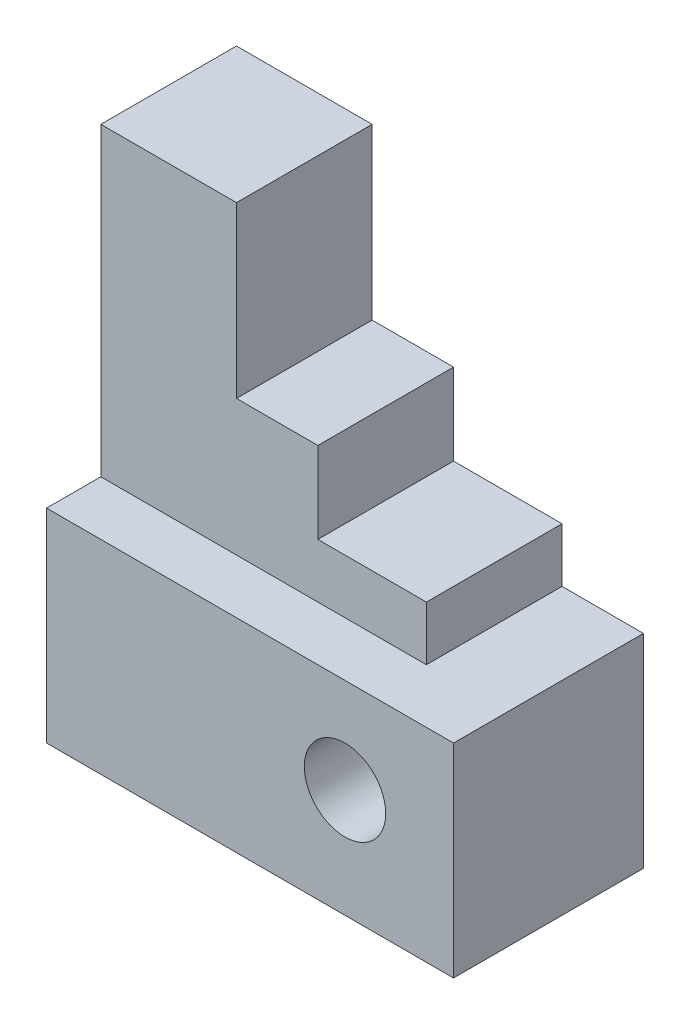
ISO-10303-21;
HEADER;
FILE_DESCRIPTION(('STEP AP214'),'2;1');
FILE_NAME('part.step','',(''),(''),'','','');
FILE_SCHEMA(('AUTOMOTIVE_DESIGN { 1 0 10303 214 1 1 1 1 }'));
ENDSEC;
DATA;
#1=APPLICATION_CONTEXT('core data for automotive mechanical design processes');
#2=APPLICATION_PROTOCOL_DEFINITION('international standard','automotive_design',2000,#1);
#3=PRODUCT_CONTEXT('',#1,'mechanical');
#4=PRODUCT('Part','Part','',(#3));
#5=PRODUCT_RELATED_PRODUCT_CATEGORY('part','',(#4));
#6=PRODUCT_DEFINITION_FORMATION('','',#4);
#7=PRODUCT_DEFINITION_CONTEXT('part definition',#1,'design');
#8=PRODUCT_DEFINITION('design','',#6,#7);
#9=PRODUCT_DEFINITION_SHAPE('','',#8);
#10=(LENGTH_UNIT() NAMED_UNIT(*) SI_UNIT(.MILLI.,.METRE.));
#11=(NAMED_UNIT(*) PLANE_ANGLE_UNIT() SI_UNIT($,.RADIAN.));
#12=(NAMED_UNIT(*) SI_UNIT($,.STERADIAN.) SOLID_ANGLE_UNIT());
#13=UNCERTAINTY_MEASURE_WITH_UNIT(LENGTH_MEASURE(1.E-05),#10,'distance_accuracy_value','');
#14=(GEOMETRIC_REPRESENTATION_CONTEXT(3) GLOBAL_UNCERTAINTY_ASSIGNED_CONTEXT((#13)) GLOBAL_UNIT_ASSIGNED_CONTEXT((#10,
#11,#12)) REPRESENTATION_CONTEXT('',''));
#15=CARTESIAN_POINT('',(0.,0.,0.));
#16=DIRECTION('',(0.,0.,1.));
#17=DIRECTION('',(1.,0.,0.));
#18=AXIS2_PLACEMENT_3D('',#15,#16,#17);
#19=CARTESIAN_POINT('',(-20.7047570256123,30.,291587.082888911));
#20=DIRECTION('',(-1.,0.,0.));
#21=DIRECTION('',(0.,0.,1.));
#22=AXIS2_PLACEMENT_3D('',#19,#20,#21);
#23=PLANE('',#22);
#24=DIRECTION('',(0.,0.,-1.));
#25=VECTOR('',#24,1.);
#26=CARTESIAN_POINT('',(-20.7047570256123,0.,291587.082888911));
#27=LINE('',#26,#25);
#28=CARTESIAN_POINT('',(-20.7047570256484,0.,16.4828889111277));
#29=VERTEX_POINT('',#28);
#30=CARTESIAN_POINT('',(-20.7047570256625,0.,-11.5171110888483));
#31=VERTEX_POINT('',#30);
#32=EDGE_CURVE('E113',#29,#31,#27,.T.);
#33=ORIENTED_EDGE('',*,*,#32,.F.);
#34=DIRECTION('',(0.,-1.,0.));
#35=VECTOR('',#34,1.);
#36=CARTESIAN_POINT('',(-20.7047570256484,30.,16.4828889111277));
#37=LINE('',#36,#35);
#38=CARTESIAN_POINT('',(-20.7047570256484,30.,16.4828889111277));
#39=VERTEX_POINT('',#38);
#40=EDGE_CURVE('E11',#39,#29,#37,.T.);
#41=ORIENTED_EDGE('',*,*,#40,.F.);
#42=DIRECTION('',(0.,0.,-1.));
#43=VECTOR('',#42,1.);
#44=CARTESIAN_POINT('',(-20.7047570256123,30.,291587.082888911));
#45=LINE('',#44,#43);
#46=CARTESIAN_POINT('',(-20.7047570256484,30.,8.48288891114635));
#47=VERTEX_POINT('',#46);
#48=EDGE_CURVE('E110',#39,#47,#45,.T.);
#49=ORIENTED_EDGE('',*,*,#48,.T.);
#50=DIRECTION('',(0.,-1.,0.));
#51=VECTOR('',#50,1.);
#52=CARTESIAN_POINT('',(-20.7047570256625,75.,8.48288891115174));
#53=LINE('',#52,#51);
#54=CARTESIAN_POINT('',(-20.7047570256625,75.,8.48288891115174));
#55=VERTEX_POINT('',#54);
#56=EDGE_CURVE('E117',#55,#47,#53,.T.);
#57=ORIENTED_EDGE('',*,*,#56,.F.);
#58=DIRECTION('',(0.,0.,1.));
#59=VECTOR('',#58,1.);
#60=CARTESIAN_POINT('',(-20.7047570256625,75.,0.));
#61=LINE('',#60,#59);
#62=CARTESIAN_POINT('',(-20.7047570256625,75.,-11.5171110888483));
#63=VERTEX_POINT('',#62);
#64=EDGE_CURVE('E139',#63,#55,#61,.T.);
#65=ORIENTED_EDGE('',*,*,#64,.F.);
#66=DIRECTION('',(0.,-1.,0.));
#67=VECTOR('',#66,1.);
#68=CARTESIAN_POINT('',(-20.7047570256625,75.,-11.5171110888483));
#69=LINE('',#68,#67);
#70=EDGE_CURVE('E140',#63,#31,#69,.T.);
#71=ORIENTED_EDGE('',*,*,#70,.T.);
#72=EDGE_LOOP('',(#33,#41,#49,#57,#65,#71));
#73=FACE_BOUND('',#72,.T.);
#74=ADVANCED_FACE('F41',(#73),#23,.T.);
#75=CARTESIAN_POINT('',(-399992.704757026,30.,16.4828889111277));
#76=DIRECTION('',(0.,0.,1.));
#77=DIRECTION('',(1.,0.,0.));
#78=AXIS2_PLACEMENT_3D('',#75,#76,#77);
#79=PLANE('',#78);
#80=CARTESIAN_POINT('',(23.2952429743332,16.,16.4828889111277));
#81=DIRECTION('',(0.,0.,1.));
#82=DIRECTION('',(1.,0.,0.));
#83=AXIS2_PLACEMENT_3D('',#80,#81,#82);
#84=CIRCLE('',#83,6.);
#85=CARTESIAN_POINT('',(29.2952429743332,16.,16.4828889111277));
#86=VERTEX_POINT('',#85);
#87=EDGE_CURVE('E212',#86,#86,#84,.T.);
#88=ORIENTED_EDGE('',*,*,#87,.F.);
#89=EDGE_LOOP('',(#88));
#90=FACE_BOUND('',#89,.T.);
#91=DIRECTION('',(-1.,0.,0.));
#92=VECTOR('',#91,1.);
#93=CARTESIAN_POINT('',(-399992.704757026,0.,16.4828889111277));
#94=LINE('',#93,#92);
#95=CARTESIAN_POINT('',(39.2952429743332,0.,16.4828889111277));
#96=VERTEX_POINT('',#95);
#97=EDGE_CURVE('E100',#96,#29,#94,.T.);
#98=ORIENTED_EDGE('',*,*,#97,.F.);
#99=DIRECTION('',(0.,-1.,0.));
#100=VECTOR('',#99,1.);
#101=CARTESIAN_POINT('',(39.2952429743332,30.,16.4828889111277));
#102=LINE('',#101,#100);
#103=CARTESIAN_POINT('',(39.2952429743332,30.,16.4828889111277));
#104=VERTEX_POINT('',#103);
#105=EDGE_CURVE('E47',#104,#96,#102,.T.);
#106=ORIENTED_EDGE('',*,*,#105,.F.);
#107=DIRECTION('',(-1.,0.,0.));
#108=VECTOR('',#107,1.);
#109=CARTESIAN_POINT('',(-399992.704757026,30.,16.4828889111277));
#110=LINE('',#109,#108);
#111=EDGE_CURVE('E92',#104,#39,#110,.T.);
#112=ORIENTED_EDGE('',*,*,#111,.T.);
#113=ORIENTED_EDGE('',*,*,#40,.T.);
#114=EDGE_LOOP('',(#98,#106,#112,#113));
#115=FACE_BOUND('',#114,.T.);
#116=ADVANCED_FACE('F91',(#90,#115),#79,.T.);
#117=CARTESIAN_POINT('',(39.2952429742763,30.,291587.082888911));
#118=DIRECTION('',(-1.,0.,0.));
#119=DIRECTION('',(0.,0.,1.));
#120=AXIS2_PLACEMENT_3D('',#117,#118,#119);
#121=PLANE('',#120);
#122=DIRECTION('',(0.,0.,-1.));
#123=VECTOR('',#122,1.);
#124=CARTESIAN_POINT('',(39.2952429742763,0.,291587.082888911));
#125=LINE('',#124,#123);
#126=CARTESIAN_POINT('',(39.2952429743486,0.,-11.5171110888355));
#127=VERTEX_POINT('',#126);
#128=EDGE_CURVE('E73',#96,#127,#125,.T.);
#129=ORIENTED_EDGE('',*,*,#128,.T.);
#130=DIRECTION('',(0.,-1.,0.));
#131=VECTOR('',#130,1.);
#132=CARTESIAN_POINT('',(39.2952429743486,30.,-11.5171110888355));
#133=LINE('',#132,#131);
#134=CARTESIAN_POINT('',(39.2952429743486,30.,-11.5171110888355));
#135=VERTEX_POINT('',#134);
#136=EDGE_CURVE('E98',#135,#127,#133,.T.);
#137=ORIENTED_EDGE('',*,*,#136,.F.);
#138=DIRECTION('',(0.,0.,-1.));
#139=VECTOR('',#138,1.);
#140=CARTESIAN_POINT('',(39.2952429742763,30.,291587.082888911));
#141=LINE('',#140,#139);
#142=EDGE_CURVE('E97',#104,#135,#141,.T.);
#143=ORIENTED_EDGE('',*,*,#142,.F.);
#144=ORIENTED_EDGE('',*,*,#105,.T.);
#145=EDGE_LOOP('',(#129,#137,#143,#144));
#146=FACE_BOUND('',#145,.T.);
#147=ADVANCED_FACE('F99',(#146),#121,.F.);
#148=CARTESIAN_POINT('',(-399992.704757026,30.,-11.5171110888355));
#149=DIRECTION('',(0.,0.,1.));
#150=DIRECTION('',(1.,0.,0.));
#151=AXIS2_PLACEMENT_3D('',#148,#149,#150);
#152=PLANE('',#151);
#153=CARTESIAN_POINT('',(23.2952429743332,16.,-11.5171110888723));
#154=DIRECTION('',(0.,0.,1.));
#155=DIRECTION('',(1.,0.,0.));
#156=AXIS2_PLACEMENT_3D('',#153,#154,#155);
#157=CIRCLE('',#156,6.);
#158=CARTESIAN_POINT('',(29.2952429743332,16.,-11.5171110888723));
#159=VERTEX_POINT('',#158);
#160=EDGE_CURVE('E213',#159,#159,#157,.T.);
#161=ORIENTED_EDGE('',*,*,#160,.T.);
#162=EDGE_LOOP('',(#161));
#163=FACE_BOUND('',#162,.T.);
#164=DIRECTION('',(-1.,0.,0.));
#165=VECTOR('',#164,1.);
#166=CARTESIAN_POINT('',(-399992.704757026,0.,-11.5171110888355));
#167=LINE('',#166,#165);
#168=EDGE_CURVE('E121',#127,#31,#167,.T.);
#169=ORIENTED_EDGE('',*,*,#168,.T.);
#170=ORIENTED_EDGE('',*,*,#70,.F.);
#171=DIRECTION('',(1.,0.,0.));
#172=VECTOR('',#171,1.);
#173=CARTESIAN_POINT('',(0.,75.,-11.5171110888483));
#174=LINE('',#173,#172);
#175=CARTESIAN_POINT('',(-0.704757025662455,75.,-11.5171110888483));
#176=VERTEX_POINT('',#175);
#177=EDGE_CURVE('E145',#63,#176,#174,.T.);
#178=ORIENTED_EDGE('',*,*,#177,.T.);
#179=DIRECTION('',(0.,-1.,0.));
#180=VECTOR('',#179,1.);
#181=CARTESIAN_POINT('',(-0.704757025662455,75.,-11.5171110888483));
#182=LINE('',#181,#180);
#183=CARTESIAN_POINT('',(-0.704757025662455,50.,-11.5171110888483));
#184=VERTEX_POINT('',#183);
#185=EDGE_CURVE('E141',#176,#184,#182,.T.);
#186=ORIENTED_EDGE('',*,*,#185,.T.);
#187=DIRECTION('',(1.,0.,0.));
#188=VECTOR('',#187,1.);
#189=CARTESIAN_POINT('',(0.,50.,-11.5171110888483));
#190=LINE('',#189,#188);
#191=CARTESIAN_POINT('',(11.2952429743375,50.,-11.5171110888483));
#192=VERTEX_POINT('',#191);
#193=EDGE_CURVE('E189',#184,#192,#190,.T.);
#194=ORIENTED_EDGE('',*,*,#193,.T.);
#195=DIRECTION('',(0.,-1.,0.));
#196=VECTOR('',#195,1.);
#197=CARTESIAN_POINT('',(11.2952429743375,50.,-11.5171110888483));
#198=LINE('',#197,#196);
#199=CARTESIAN_POINT('',(11.2952429743375,38.,-11.5171110888483));
#200=VERTEX_POINT('',#199);
#201=EDGE_CURVE('E186',#192,#200,#198,.T.);
#202=ORIENTED_EDGE('',*,*,#201,.T.);
#203=DIRECTION('',(1.,0.,0.));
#204=VECTOR('',#203,1.);
#205=CARTESIAN_POINT('',(0.,38.,-11.5171110888483));
#206=LINE('',#205,#204);
#207=CARTESIAN_POINT('',(27.2952429743375,38.,-11.5171110888483));
#208=VERTEX_POINT('',#207);
#209=EDGE_CURVE('E203',#200,#208,#206,.T.);
#210=ORIENTED_EDGE('',*,*,#209,.T.);
#211=DIRECTION('',(0.,-1.,0.));
#212=VECTOR('',#211,1.);
#213=CARTESIAN_POINT('',(27.2952429743375,38.,-11.5171110888483));
#214=LINE('',#213,#212);
#215=CARTESIAN_POINT('',(27.2952429743375,30.,-11.5171110888483));
#216=VERTEX_POINT('',#215);
#217=EDGE_CURVE('E200',#208,#216,#214,.T.);
#218=ORIENTED_EDGE('',*,*,#217,.T.);
#219=DIRECTION('',(-1.,0.,0.));
#220=VECTOR('',#219,1.);
#221=CARTESIAN_POINT('',(-399992.704757026,30.,-11.5171110888355));
#222=LINE('',#221,#220);
#223=EDGE_CURVE('E103',#135,#216,#222,.T.);
#224=ORIENTED_EDGE('',*,*,#223,.F.);
#225=ORIENTED_EDGE('',*,*,#136,.T.);
#226=EDGE_LOOP('',(#169,#170,#178,#186,#194,#202,#210,#218,#224,#225));
#227=FACE_BOUND('',#226,.T.);
#228=ADVANCED_FACE('F127',(#163,#227),#152,.F.);
#229=CARTESIAN_POINT('',(0.,30.,0.));
#230=DIRECTION('',(0.,-1.,0.));
#231=DIRECTION('',(0.,0.,-1.));
#232=AXIS2_PLACEMENT_3D('',#229,#230,#231);
#233=PLANE('',#232);
#234=DIRECTION('',(-1.,0.,0.));
#235=VECTOR('',#234,1.);
#236=CARTESIAN_POINT('',(-399992.704757026,30.,8.48288891114635));
#237=LINE('',#236,#235);
#238=CARTESIAN_POINT('',(27.2952429743327,30.,8.48288891114635));
#239=VERTEX_POINT('',#238);
#240=EDGE_CURVE('E83',#239,#47,#237,.T.);
#241=ORIENTED_EDGE('',*,*,#240,.T.);
#242=ORIENTED_EDGE('',*,*,#48,.F.);
#243=ORIENTED_EDGE('',*,*,#111,.F.);
#244=ORIENTED_EDGE('',*,*,#142,.T.);
#245=ORIENTED_EDGE('',*,*,#223,.T.);
#246=DIRECTION('',(0.,0.,1.));
#247=VECTOR('',#246,1.);
#248=CARTESIAN_POINT('',(27.2952429743327,30.,291587.082888911));
#249=LINE('',#248,#247);
#250=EDGE_CURVE('E114',#216,#239,#249,.T.);
#251=ORIENTED_EDGE('',*,*,#250,.T.);
#252=EDGE_LOOP('',(#241,#242,#243,#244,#245,#251));
#253=FACE_BOUND('',#252,.T.);
#254=ADVANCED_FACE('F104',(#253),#233,.F.);
#255=CARTESIAN_POINT('',(0.,0.,0.));
#256=DIRECTION('',(0.,-1.,0.));
#257=DIRECTION('',(0.,0.,-1.));
#258=AXIS2_PLACEMENT_3D('',#255,#256,#257);
#259=PLANE('',#258);
#260=ORIENTED_EDGE('',*,*,#32,.T.);
#261=ORIENTED_EDGE('',*,*,#168,.F.);
#262=ORIENTED_EDGE('',*,*,#128,.F.);
#263=ORIENTED_EDGE('',*,*,#97,.T.);
#264=EDGE_LOOP('',(#260,#261,#262,#263));
#265=FACE_BOUND('',#264,.T.);
#266=ADVANCED_FACE('F128',(#265),#259,.T.);
#267=CARTESIAN_POINT('',(0.,75.,8.48288891115174));
#268=DIRECTION('',(0.,0.,-1.));
#269=DIRECTION('',(-1.,0.,0.));
#270=AXIS2_PLACEMENT_3D('',#267,#268,#269);
#271=PLANE('',#270);
#272=ORIENTED_EDGE('',*,*,#56,.T.);
#273=ORIENTED_EDGE('',*,*,#240,.F.);
#274=DIRECTION('',(0.,-1.,0.));
#275=VECTOR('',#274,1.);
#276=CARTESIAN_POINT('',(27.2952429743375,38.,8.48288891115174));
#277=LINE('',#276,#275);
#278=CARTESIAN_POINT('',(27.2952429743375,38.,8.48288891115174));
#279=VERTEX_POINT('',#278);
#280=EDGE_CURVE('E60',#279,#239,#277,.T.);
#281=ORIENTED_EDGE('',*,*,#280,.F.);
#282=DIRECTION('',(1.,0.,0.));
#283=VECTOR('',#282,1.);
#284=CARTESIAN_POINT('',(0.,38.,8.48288891115174));
#285=LINE('',#284,#283);
#286=CARTESIAN_POINT('',(11.2952429743375,38.,8.48288891115174));
#287=VERTEX_POINT('',#286);
#288=EDGE_CURVE('E210',#287,#279,#285,.T.);
#289=ORIENTED_EDGE('',*,*,#288,.F.);
#290=DIRECTION('',(0.,-1.,0.));
#291=VECTOR('',#290,1.);
#292=CARTESIAN_POINT('',(11.2952429743375,50.,8.48288891115174));
#293=LINE('',#292,#291);
#294=CARTESIAN_POINT('',(11.2952429743375,50.,8.48288891115174));
#295=VERTEX_POINT('',#294);
#296=EDGE_CURVE('E181',#295,#287,#293,.T.);
#297=ORIENTED_EDGE('',*,*,#296,.F.);
#298=DIRECTION('',(1.,0.,0.));
#299=VECTOR('',#298,1.);
#300=CARTESIAN_POINT('',(0.,50.,8.48288891115174));
#301=LINE('',#300,#299);
#302=CARTESIAN_POINT('',(-0.704757025662453,50.,8.48288891115174));
#303=VERTEX_POINT('',#302);
#304=EDGE_CURVE('E194',#303,#295,#301,.T.);
#305=ORIENTED_EDGE('',*,*,#304,.F.);
#306=DIRECTION('',(0.,-1.,0.));
#307=VECTOR('',#306,1.);
#308=CARTESIAN_POINT('',(-0.704757025662453,75.,8.48288891115174));
#309=LINE('',#308,#307);
#310=CARTESIAN_POINT('',(-0.704757025662453,75.,8.48288891115174));
#311=VERTEX_POINT('',#310);
#312=EDGE_CURVE('E150',#311,#303,#309,.T.);
#313=ORIENTED_EDGE('',*,*,#312,.F.);
#314=DIRECTION('',(1.,0.,0.));
#315=VECTOR('',#314,1.);
#316=CARTESIAN_POINT('',(0.,75.,8.48288891115174));
#317=LINE('',#316,#315);
#318=EDGE_CURVE('E159',#55,#311,#317,.T.);
#319=ORIENTED_EDGE('',*,*,#318,.F.);
#320=EDGE_LOOP('',(#272,#273,#281,#289,#297,#305,#313,#319));
#321=FACE_BOUND('',#320,.T.);
#322=ADVANCED_FACE('F160',(#321),#271,.F.);
#323=CARTESIAN_POINT('',(-0.704757025662454,75.,0.));
#324=DIRECTION('',(1.,0.,0.));
#325=DIRECTION('',(0.,0.,-1.));
#326=AXIS2_PLACEMENT_3D('',#323,#324,#325);
#327=PLANE('',#326);
#328=DIRECTION('',(0.,0.,1.));
#329=VECTOR('',#328,1.);
#330=CARTESIAN_POINT('',(-0.704757025662454,50.,0.));
#331=LINE('',#330,#329);
#332=EDGE_CURVE('E176',#184,#303,#331,.T.);
#333=ORIENTED_EDGE('',*,*,#332,.F.);
#334=ORIENTED_EDGE('',*,*,#185,.F.);
#335=DIRECTION('',(0.,0.,1.));
#336=VECTOR('',#335,1.);
#337=CARTESIAN_POINT('',(-0.704757025662454,75.,0.));
#338=LINE('',#337,#336);
#339=EDGE_CURVE('E149',#176,#311,#338,.T.);
#340=ORIENTED_EDGE('',*,*,#339,.T.);
#341=ORIENTED_EDGE('',*,*,#312,.T.);
#342=EDGE_LOOP('',(#333,#334,#340,#341));
#343=FACE_BOUND('',#342,.T.);
#344=ADVANCED_FACE('F172',(#343),#327,.T.);
#345=CARTESIAN_POINT('',(0.,75.,0.));
#346=DIRECTION('',(0.,1.,0.));
#347=DIRECTION('',(0.,0.,1.));
#348=AXIS2_PLACEMENT_3D('',#345,#346,#347);
#349=PLANE('',#348);
#350=ORIENTED_EDGE('',*,*,#64,.T.);
#351=ORIENTED_EDGE('',*,*,#318,.T.);
#352=ORIENTED_EDGE('',*,*,#339,.F.);
#353=ORIENTED_EDGE('',*,*,#177,.F.);
#354=EDGE_LOOP('',(#350,#351,#352,#353));
#355=FACE_BOUND('',#354,.T.);
#356=ADVANCED_FACE('F177',(#355),#349,.T.);
#357=CARTESIAN_POINT('',(11.2952429743375,50.,0.));
#358=DIRECTION('',(-1.,0.,0.));
#359=DIRECTION('',(0.,0.,1.));
#360=AXIS2_PLACEMENT_3D('',#357,#358,#359);
#361=PLANE('',#360);
#362=ORIENTED_EDGE('',*,*,#296,.T.);
#363=DIRECTION('',(0.,0.,-1.));
#364=VECTOR('',#363,1.);
#365=CARTESIAN_POINT('',(11.2952429743375,38.,0.));
#366=LINE('',#365,#364);
#367=EDGE_CURVE('E209',#287,#200,#366,.T.);
#368=ORIENTED_EDGE('',*,*,#367,.T.);
#369=ORIENTED_EDGE('',*,*,#201,.F.);
#370=DIRECTION('',(0.,0.,-1.));
#371=VECTOR('',#370,1.);
#372=CARTESIAN_POINT('',(11.2952429743375,50.,0.));
#373=LINE('',#372,#371);
#374=EDGE_CURVE('E195',#295,#192,#373,.T.);
#375=ORIENTED_EDGE('',*,*,#374,.F.);
#376=EDGE_LOOP('',(#362,#368,#369,#375));
#377=FACE_BOUND('',#376,.T.);
#378=ADVANCED_FACE('F248',(#377),#361,.F.);
#379=CARTESIAN_POINT('',(0.,50.,0.));
#380=DIRECTION('',(0.,1.,0.));
#381=DIRECTION('',(0.,0.,1.));
#382=AXIS2_PLACEMENT_3D('',#379,#380,#381);
#383=PLANE('',#382);
#384=ORIENTED_EDGE('',*,*,#304,.T.);
#385=ORIENTED_EDGE('',*,*,#374,.T.);
#386=ORIENTED_EDGE('',*,*,#193,.F.);
#387=ORIENTED_EDGE('',*,*,#332,.T.);
#388=EDGE_LOOP('',(#384,#385,#386,#387));
#389=FACE_BOUND('',#388,.T.);
#390=ADVANCED_FACE('F253',(#389),#383,.T.);
#391=CARTESIAN_POINT('',(27.2952429743375,38.,0.));
#392=DIRECTION('',(-1.,0.,0.));
#393=DIRECTION('',(0.,0.,1.));
#394=AXIS2_PLACEMENT_3D('',#391,#392,#393);
#395=PLANE('',#394);
#396=ORIENTED_EDGE('',*,*,#280,.T.);
#397=ORIENTED_EDGE('',*,*,#250,.F.);
#398=ORIENTED_EDGE('',*,*,#217,.F.);
#399=DIRECTION('',(0.,0.,-1.));
#400=VECTOR('',#399,1.);
#401=CARTESIAN_POINT('',(27.2952429743375,38.,0.));
#402=LINE('',#401,#400);
#403=EDGE_CURVE('E204',#279,#208,#402,.T.);
#404=ORIENTED_EDGE('',*,*,#403,.F.);
#405=EDGE_LOOP('',(#396,#397,#398,#404));
#406=FACE_BOUND('',#405,.T.);
#407=ADVANCED_FACE('F254',(#406),#395,.F.);
#408=CARTESIAN_POINT('',(0.,38.,0.));
#409=DIRECTION('',(0.,1.,0.));
#410=DIRECTION('',(0.,0.,1.));
#411=AXIS2_PLACEMENT_3D('',#408,#409,#410);
#412=PLANE('',#411);
#413=ORIENTED_EDGE('',*,*,#367,.F.);
#414=ORIENTED_EDGE('',*,*,#288,.T.);
#415=ORIENTED_EDGE('',*,*,#403,.T.);
#416=ORIENTED_EDGE('',*,*,#209,.F.);
#417=EDGE_LOOP('',(#413,#414,#415,#416));
#418=FACE_BOUND('',#417,.T.);
#419=ADVANCED_FACE('F221',(#418),#412,.T.);
#420=CARTESIAN_POINT('',(23.2952429743332,16.,-11.5171110888723));
#421=DIRECTION('',(0.,0.,1.));
#422=DIRECTION('',(1.,0.,0.));
#423=AXIS2_PLACEMENT_3D('',#420,#421,#422);
#424=CYLINDRICAL_SURFACE('',#423,6.);
#425=ORIENTED_EDGE('',*,*,#160,.F.);
#426=EDGE_LOOP('',(#425));
#427=FACE_BOUND('',#426,.T.);
#428=ORIENTED_EDGE('',*,*,#87,.T.);
#429=EDGE_LOOP('',(#428));
#430=FACE_BOUND('',#429,.T.);
#431=ADVANCED_FACE('F222',(#427,#430),#424,.F.);
#432=CLOSED_SHELL('',(#74,#116,#147,#228,#254,#266,#322,#344,#356,#378,#390,#407,#419,#431));
#433=MANIFOLD_SOLID_BREP('B2',#432);
#434=ADVANCED_BREP_SHAPE_REPRESENTATION('',(#18,#433),#14);
#435=SHAPE_DEFINITION_REPRESENTATION(#9,#434);
ENDSEC;
END-ISO-10303-21;
